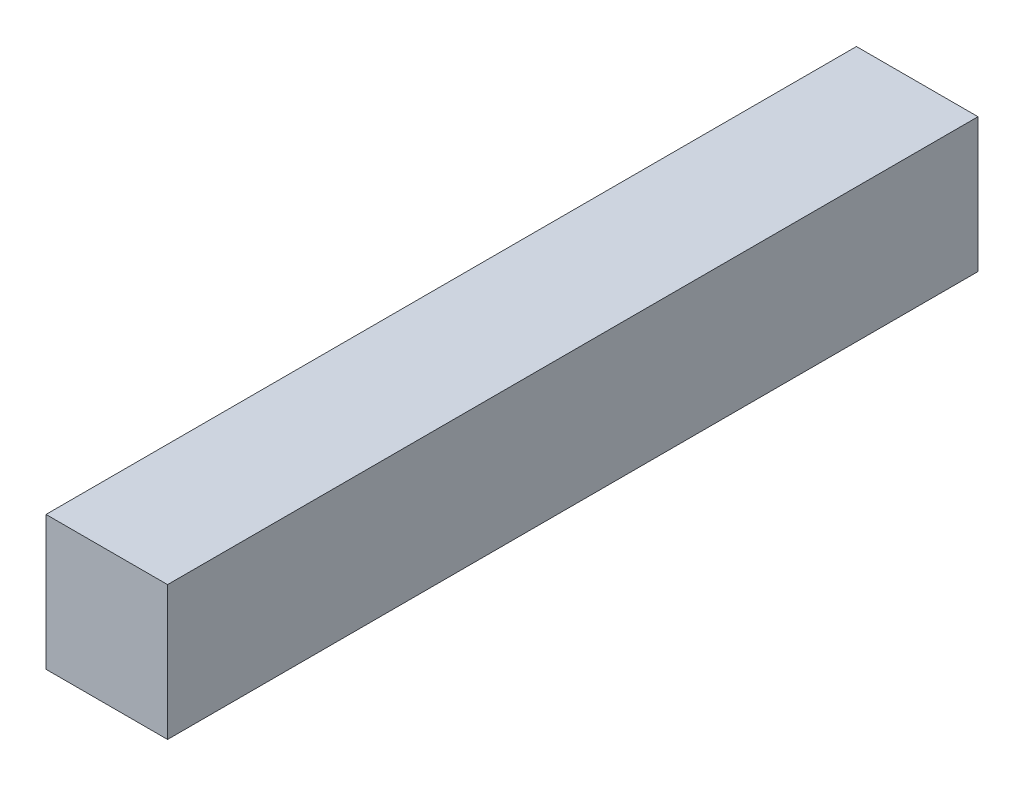
ISO-10303-21;
HEADER;
FILE_DESCRIPTION(('STEP AP214'),'2;1');
FILE_NAME('part.step','',(''),(''),'','','');
FILE_SCHEMA(('AUTOMOTIVE_DESIGN { 1 0 10303 214 1 1 1 1 }'));
ENDSEC;
DATA;
#1=APPLICATION_CONTEXT('core data for automotive mechanical design processes');
#2=APPLICATION_PROTOCOL_DEFINITION('international standard','automotive_design',2000,#1);
#3=PRODUCT_CONTEXT('',#1,'mechanical');
#4=PRODUCT('Part','Part','',(#3));
#5=PRODUCT_RELATED_PRODUCT_CATEGORY('part','',(#4));
#6=PRODUCT_DEFINITION_FORMATION('','',#4);
#7=PRODUCT_DEFINITION_CONTEXT('part definition',#1,'design');
#8=PRODUCT_DEFINITION('design','',#6,#7);
#9=PRODUCT_DEFINITION_SHAPE('','',#8);
#10=(LENGTH_UNIT() NAMED_UNIT(*) SI_UNIT(.MILLI.,.METRE.));
#11=(NAMED_UNIT(*) PLANE_ANGLE_UNIT() SI_UNIT($,.RADIAN.));
#12=(NAMED_UNIT(*) SI_UNIT($,.STERADIAN.) SOLID_ANGLE_UNIT());
#13=UNCERTAINTY_MEASURE_WITH_UNIT(LENGTH_MEASURE(1.E-05),#10,'distance_accuracy_value','');
#14=(GEOMETRIC_REPRESENTATION_CONTEXT(3) GLOBAL_UNCERTAINTY_ASSIGNED_CONTEXT((#13)) GLOBAL_UNIT_ASSIGNED_CONTEXT((#10,
#11,#12)) REPRESENTATION_CONTEXT('',''));
#15=CARTESIAN_POINT('',(0.,0.,0.));
#16=DIRECTION('',(0.,0.,1.));
#17=DIRECTION('',(1.,0.,0.));
#18=AXIS2_PLACEMENT_3D('',#15,#16,#17);
#19=CARTESIAN_POINT('',(0.,0.,40.));
#20=DIRECTION('',(1.,0.,0.));
#21=DIRECTION('',(0.,0.,-1.));
#22=AXIS2_PLACEMENT_3D('',#19,#20,#21);
#23=PLANE('',#22);
#24=DIRECTION('',(0.,-1.,0.));
#25=VECTOR('',#24,1.);
#26=CARTESIAN_POINT('',(0.,0.,0.));
#27=LINE('',#26,#25);
#28=CARTESIAN_POINT('',(0.,6.62,0.));
#29=VERTEX_POINT('',#28);
#30=CARTESIAN_POINT('',(0.,0.,0.));
#31=VERTEX_POINT('',#30);
#32=EDGE_CURVE('E102',#29,#31,#27,.T.);
#33=ORIENTED_EDGE('',*,*,#32,.T.);
#34=DIRECTION('',(0.,0.,-1.));
#35=VECTOR('',#34,1.);
#36=CARTESIAN_POINT('',(0.,0.,40.));
#37=LINE('',#36,#35);
#38=CARTESIAN_POINT('',(0.,0.,40.));
#39=VERTEX_POINT('',#38);
#40=EDGE_CURVE('E11',#39,#31,#37,.T.);
#41=ORIENTED_EDGE('',*,*,#40,.F.);
#42=DIRECTION('',(0.,-1.,0.));
#43=VECTOR('',#42,1.);
#44=CARTESIAN_POINT('',(0.,0.,40.));
#45=LINE('',#44,#43);
#46=CARTESIAN_POINT('',(0.,6.62,40.));
#47=VERTEX_POINT('',#46);
#48=EDGE_CURVE('E90',#47,#39,#45,.T.);
#49=ORIENTED_EDGE('',*,*,#48,.F.);
#50=DIRECTION('',(0.,0.,-1.));
#51=VECTOR('',#50,1.);
#52=CARTESIAN_POINT('',(0.,6.62,40.));
#53=LINE('',#52,#51);
#54=EDGE_CURVE('E98',#47,#29,#53,.T.);
#55=ORIENTED_EDGE('',*,*,#54,.T.);
#56=EDGE_LOOP('',(#33,#41,#49,#55));
#57=FACE_BOUND('',#56,.T.);
#58=ADVANCED_FACE('F39',(#57),#23,.F.);
#59=CARTESIAN_POINT('',(0.,0.,40.));
#60=DIRECTION('',(0.,1.,0.));
#61=DIRECTION('',(0.,0.,1.));
#62=AXIS2_PLACEMENT_3D('',#59,#60,#61);
#63=PLANE('',#62);
#64=DIRECTION('',(1.,0.,0.));
#65=VECTOR('',#64,1.);
#66=CARTESIAN_POINT('',(0.,0.,0.));
#67=LINE('',#66,#65);
#68=CARTESIAN_POINT('',(6.,0.,0.));
#69=VERTEX_POINT('',#68);
#70=EDGE_CURVE('E94',#31,#69,#67,.T.);
#71=ORIENTED_EDGE('',*,*,#70,.T.);
#72=DIRECTION('',(0.,0.,-1.));
#73=VECTOR('',#72,1.);
#74=CARTESIAN_POINT('',(6.,0.,40.));
#75=LINE('',#74,#73);
#76=CARTESIAN_POINT('',(6.,0.,40.));
#77=VERTEX_POINT('',#76);
#78=EDGE_CURVE('E47',#77,#69,#75,.T.);
#79=ORIENTED_EDGE('',*,*,#78,.F.);
#80=DIRECTION('',(1.,0.,0.));
#81=VECTOR('',#80,1.);
#82=CARTESIAN_POINT('',(0.,0.,40.));
#83=LINE('',#82,#81);
#84=EDGE_CURVE('E85',#39,#77,#83,.T.);
#85=ORIENTED_EDGE('',*,*,#84,.F.);
#86=ORIENTED_EDGE('',*,*,#40,.T.);
#87=EDGE_LOOP('',(#71,#79,#85,#86));
#88=FACE_BOUND('',#87,.T.);
#89=ADVANCED_FACE('F93',(#88),#63,.F.);
#90=CARTESIAN_POINT('',(6.,0.,40.));
#91=DIRECTION('',(-1.,0.,0.));
#92=DIRECTION('',(0.,0.,1.));
#93=AXIS2_PLACEMENT_3D('',#90,#91,#92);
#94=PLANE('',#93);
#95=DIRECTION('',(0.,1.,0.));
#96=VECTOR('',#95,1.);
#97=CARTESIAN_POINT('',(6.,0.,0.));
#98=LINE('',#97,#96);
#99=CARTESIAN_POINT('',(6.,6.62,0.));
#100=VERTEX_POINT('',#99);
#101=EDGE_CURVE('E72',#69,#100,#98,.T.);
#102=ORIENTED_EDGE('',*,*,#101,.T.);
#103=DIRECTION('',(0.,0.,-1.));
#104=VECTOR('',#103,1.);
#105=CARTESIAN_POINT('',(6.,6.62,40.));
#106=LINE('',#105,#104);
#107=CARTESIAN_POINT('',(6.,6.62,40.));
#108=VERTEX_POINT('',#107);
#109=EDGE_CURVE('E95',#108,#100,#106,.T.);
#110=ORIENTED_EDGE('',*,*,#109,.F.);
#111=DIRECTION('',(0.,1.,0.));
#112=VECTOR('',#111,1.);
#113=CARTESIAN_POINT('',(6.,0.,40.));
#114=LINE('',#113,#112);
#115=EDGE_CURVE('E88',#77,#108,#114,.T.);
#116=ORIENTED_EDGE('',*,*,#115,.F.);
#117=ORIENTED_EDGE('',*,*,#78,.T.);
#118=EDGE_LOOP('',(#102,#110,#116,#117));
#119=FACE_BOUND('',#118,.T.);
#120=ADVANCED_FACE('F96',(#119),#94,.F.);
#121=CARTESIAN_POINT('',(0.,6.62,40.));
#122=DIRECTION('',(0.,-1.,0.));
#123=DIRECTION('',(0.,0.,-1.));
#124=AXIS2_PLACEMENT_3D('',#121,#122,#123);
#125=PLANE('',#124);
#126=DIRECTION('',(-1.,0.,0.));
#127=VECTOR('',#126,1.);
#128=CARTESIAN_POINT('',(0.,6.62,0.));
#129=LINE('',#128,#127);
#130=EDGE_CURVE('E78',#100,#29,#129,.T.);
#131=ORIENTED_EDGE('',*,*,#130,.T.);
#132=ORIENTED_EDGE('',*,*,#54,.F.);
#133=DIRECTION('',(-1.,0.,0.));
#134=VECTOR('',#133,1.);
#135=CARTESIAN_POINT('',(0.,6.62,40.));
#136=LINE('',#135,#134);
#137=EDGE_CURVE('E55',#108,#47,#136,.T.);
#138=ORIENTED_EDGE('',*,*,#137,.F.);
#139=ORIENTED_EDGE('',*,*,#109,.T.);
#140=EDGE_LOOP('',(#131,#132,#138,#139));
#141=FACE_BOUND('',#140,.T.);
#142=ADVANCED_FACE('F109',(#141),#125,.F.);
#143=CARTESIAN_POINT('',(0.,0.,40.));
#144=DIRECTION('',(0.,0.,-1.));
#145=DIRECTION('',(-1.,0.,0.));
#146=AXIS2_PLACEMENT_3D('',#143,#144,#145);
#147=PLANE('',#146);
#148=ORIENTED_EDGE('',*,*,#48,.T.);
#149=ORIENTED_EDGE('',*,*,#84,.T.);
#150=ORIENTED_EDGE('',*,*,#115,.T.);
#151=ORIENTED_EDGE('',*,*,#137,.T.);
#152=EDGE_LOOP('',(#148,#149,#150,#151));
#153=FACE_BOUND('',#152,.T.);
#154=ADVANCED_FACE('F86',(#153),#147,.F.);
#155=CARTESIAN_POINT('',(0.,0.,0.));
#156=DIRECTION('',(0.,0.,-1.));
#157=DIRECTION('',(-1.,0.,0.));
#158=AXIS2_PLACEMENT_3D('',#155,#156,#157);
#159=PLANE('',#158);
#160=ORIENTED_EDGE('',*,*,#32,.F.);
#161=ORIENTED_EDGE('',*,*,#130,.F.);
#162=ORIENTED_EDGE('',*,*,#101,.F.);
#163=ORIENTED_EDGE('',*,*,#70,.F.);
#164=EDGE_LOOP('',(#160,#161,#162,#163));
#165=FACE_BOUND('',#164,.T.);
#166=ADVANCED_FACE('F112',(#165),#159,.T.);
#167=CLOSED_SHELL('',(#58,#89,#120,#142,#154,#166));
#168=MANIFOLD_SOLID_BREP('B2',#167);
#169=ADVANCED_BREP_SHAPE_REPRESENTATION('',(#18,#168),#14);
#170=SHAPE_DEFINITION_REPRESENTATION(#9,#169);
ENDSEC;
END-ISO-10303-21;
